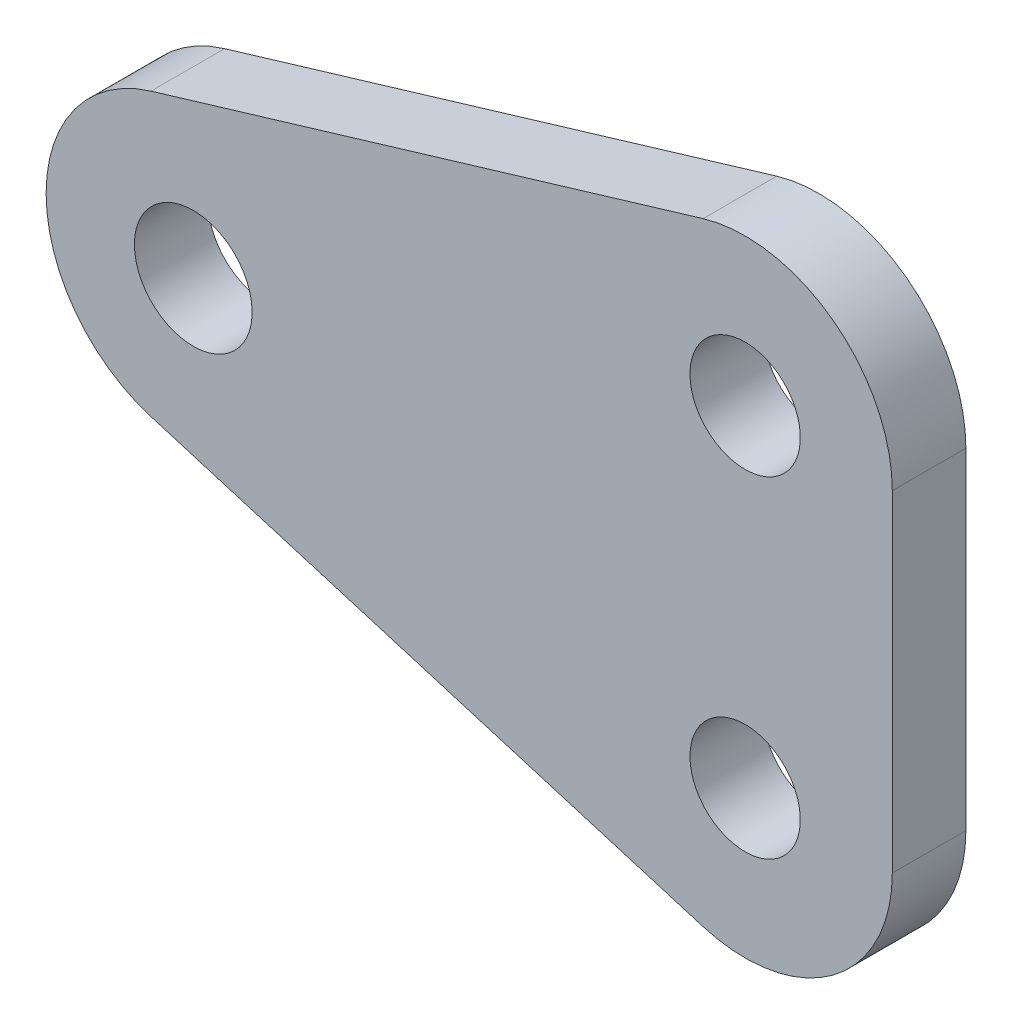
ISO-10303-21;
HEADER;
FILE_DESCRIPTION(('STEP AP214'),'2;1');
FILE_NAME('part.step','',(''),(''),'','','');
FILE_SCHEMA(('AUTOMOTIVE_DESIGN { 1 0 10303 214 1 1 1 1 }'));
ENDSEC;
DATA;
#1=APPLICATION_CONTEXT('core data for automotive mechanical design processes');
#2=APPLICATION_PROTOCOL_DEFINITION('international standard','automotive_design',2000,#1);
#3=PRODUCT_CONTEXT('',#1,'mechanical');
#4=PRODUCT('Part','Part','',(#3));
#5=PRODUCT_RELATED_PRODUCT_CATEGORY('part','',(#4));
#6=PRODUCT_DEFINITION_FORMATION('','',#4);
#7=PRODUCT_DEFINITION_CONTEXT('part definition',#1,'design');
#8=PRODUCT_DEFINITION('design','',#6,#7);
#9=PRODUCT_DEFINITION_SHAPE('','',#8);
#10=(LENGTH_UNIT() NAMED_UNIT(*) SI_UNIT(.MILLI.,.METRE.));
#11=(NAMED_UNIT(*) PLANE_ANGLE_UNIT() SI_UNIT($,.RADIAN.));
#12=(NAMED_UNIT(*) SI_UNIT($,.STERADIAN.) SOLID_ANGLE_UNIT());
#13=UNCERTAINTY_MEASURE_WITH_UNIT(LENGTH_MEASURE(1.E-05),#10,'distance_accuracy_value','');
#14=(GEOMETRIC_REPRESENTATION_CONTEXT(3) GLOBAL_UNCERTAINTY_ASSIGNED_CONTEXT((#13)) GLOBAL_UNIT_ASSIGNED_CONTEXT((#10,
#11,#12)) REPRESENTATION_CONTEXT('',''));
#15=CARTESIAN_POINT('',(0.,0.,0.));
#16=DIRECTION('',(0.,0.,1.));
#17=DIRECTION('',(1.,0.,0.));
#18=AXIS2_PLACEMENT_3D('',#15,#16,#17);
#19=CARTESIAN_POINT('',(0.,0.,0.));
#20=DIRECTION('',(0.,0.,1.));
#21=DIRECTION('',(1.,0.,0.));
#22=AXIS2_PLACEMENT_3D('',#19,#20,#21);
#23=PLANE('',#22);
#24=CARTESIAN_POINT('',(1720.59652241084,1047.22337309637,0.));
#25=DIRECTION('',(0.,0.,-1.));
#26=DIRECTION('',(-1.,0.,0.));
#27=AXIS2_PLACEMENT_3D('',#24,#25,#26);
#28=CIRCLE('',#27,4.);
#29=CARTESIAN_POINT('',(1719.44713139988,1051.05467839664,0.));
#30=VERTEX_POINT('',#29);
#31=CARTESIAN_POINT('',(1719.44713139988,1043.39206779609,0.));
#32=VERTEX_POINT('',#31);
#33=EDGE_CURVE('E119',#30,#32,#28,.F.);
#34=ORIENTED_EDGE('',*,*,#33,.F.);
#35=DIRECTION('',(-0.957826364917361,-0.287347619912181,0.));
#36=VECTOR('',#35,1.);
#37=CARTESIAN_POINT('',(-147.308424359633,491.02857601261,0.));
#38=LINE('',#37,#36);
#39=CARTESIAN_POINT('',(1734.45277928306,1055.5563682252,0.));
#40=VERTEX_POINT('',#39);
#41=EDGE_CURVE('E100',#40,#30,#38,.T.);
#42=ORIENTED_EDGE('',*,*,#41,.F.);
#43=CARTESIAN_POINT('',(1735.59652241084,1051.72337309637,0.));
#44=DIRECTION('',(0.,0.,-1.));
#45=DIRECTION('',(-1.,0.,0.));
#46=AXIS2_PLACEMENT_3D('',#43,#44,#45);
#47=CIRCLE('',#46,4.);
#48=CARTESIAN_POINT('',(1739.59652241084,1051.72337309637,0.));
#49=VERTEX_POINT('',#48);
#50=EDGE_CURVE('E73',#49,#40,#47,.F.);
#51=ORIENTED_EDGE('',*,*,#50,.F.);
#52=DIRECTION('',(0.,1.,0.));
#53=VECTOR('',#52,1.);
#54=CARTESIAN_POINT('',(1739.59652241084,0.,0.));
#55=LINE('',#54,#53);
#56=CARTESIAN_POINT('',(1739.59652241084,1042.72337309637,0.));
#57=VERTEX_POINT('',#56);
#58=EDGE_CURVE('E70',#57,#49,#55,.T.);
#59=ORIENTED_EDGE('',*,*,#58,.F.);
#60=CARTESIAN_POINT('',(1735.59652241084,1042.72337309637,0.));
#61=DIRECTION('',(0.,0.,-1.));
#62=DIRECTION('',(-1.,0.,0.));
#63=AXIS2_PLACEMENT_3D('',#60,#61,#62);
#64=CIRCLE('',#63,4.);
#65=CARTESIAN_POINT('',(1734.45277928306,1038.89037796753,0.));
#66=VERTEX_POINT('',#65);
#67=EDGE_CURVE('E67',#66,#57,#64,.F.);
#68=ORIENTED_EDGE('',*,*,#67,.F.);
#69=DIRECTION('',(-0.957826364917361,0.287347619912181,0.));
#70=VECTOR('',#69,1.);
#71=CARTESIAN_POINT('',(429.144323568253,1430.48252007072,0.));
#72=LINE('',#71,#70);
#73=EDGE_CURVE('E85',#66,#32,#72,.T.);
#74=ORIENTED_EDGE('',*,*,#73,.T.);
#75=EDGE_LOOP('',(#34,#42,#51,#59,#68,#74));
#76=FACE_BOUND('',#75,.T.);
#77=CARTESIAN_POINT('',(1735.59652241084,1042.72337309637,0.));
#78=DIRECTION('',(0.,0.,-1.));
#79=DIRECTION('',(-1.,0.,0.));
#80=AXIS2_PLACEMENT_3D('',#77,#78,#79);
#81=CIRCLE('',#80,1.50000000000006);
#82=CARTESIAN_POINT('',(1734.09652241084,1042.72337309637,0.));
#83=VERTEX_POINT('',#82);
#84=EDGE_CURVE('E99',#83,#83,#81,.F.);
#85=ORIENTED_EDGE('',*,*,#84,.T.);
#86=EDGE_LOOP('',(#85));
#87=FACE_BOUND('',#86,.T.);
#88=CARTESIAN_POINT('',(1735.59652241084,1051.72337309637,0.));
#89=DIRECTION('',(0.,0.,-1.));
#90=DIRECTION('',(-1.,0.,0.));
#91=AXIS2_PLACEMENT_3D('',#88,#89,#90);
#92=CIRCLE('',#91,1.50000000000006);
#93=CARTESIAN_POINT('',(1734.09652241084,1051.72337309637,0.));
#94=VERTEX_POINT('',#93);
#95=EDGE_CURVE('E123',#94,#94,#92,.F.);
#96=ORIENTED_EDGE('',*,*,#95,.T.);
#97=EDGE_LOOP('',(#96));
#98=FACE_BOUND('',#97,.T.);
#99=CARTESIAN_POINT('',(1720.59652241084,1047.22337309637,0.));
#100=DIRECTION('',(0.,0.,-1.));
#101=DIRECTION('',(-1.,0.,0.));
#102=AXIS2_PLACEMENT_3D('',#99,#100,#101);
#103=CIRCLE('',#102,1.60000000039995);
#104=CARTESIAN_POINT('',(1718.99652241044,1047.22337309637,0.));
#105=VERTEX_POINT('',#104);
#106=EDGE_CURVE('E20',#105,#105,#103,.F.);
#107=ORIENTED_EDGE('',*,*,#106,.T.);
#108=EDGE_LOOP('',(#107));
#109=FACE_BOUND('',#108,.T.);
#110=ADVANCED_FACE('F17',(#76,#87,#98,#109),#23,.F.);
#111=CARTESIAN_POINT('',(1720.59652241084,1047.22337309637,2.));
#112=DIRECTION('',(0.,0.,-1.));
#113=DIRECTION('',(-1.,0.,0.));
#114=AXIS2_PLACEMENT_3D('',#111,#112,#113);
#115=CYLINDRICAL_SURFACE('',#114,1.60000000039995);
#116=CARTESIAN_POINT('',(1720.59652241084,1047.22337309637,2.));
#117=DIRECTION('',(0.,0.,-1.));
#118=DIRECTION('',(-1.,0.,0.));
#119=AXIS2_PLACEMENT_3D('',#116,#117,#118);
#120=CIRCLE('',#119,1.60000000039995);
#121=CARTESIAN_POINT('',(1718.99652241044,1047.22337309637,2.));
#122=VERTEX_POINT('',#121);
#123=EDGE_CURVE('E115',#122,#122,#120,.T.);
#124=ORIENTED_EDGE('',*,*,#123,.F.);
#125=EDGE_LOOP('',(#124));
#126=FACE_BOUND('',#125,.T.);
#127=ORIENTED_EDGE('',*,*,#106,.F.);
#128=EDGE_LOOP('',(#127));
#129=FACE_BOUND('',#128,.T.);
#130=ADVANCED_FACE('F131',(#126,#129),#115,.F.);
#131=CARTESIAN_POINT('',(1735.59652241084,1051.72337309637,2.));
#132=DIRECTION('',(0.,0.,-1.));
#133=DIRECTION('',(-1.,0.,0.));
#134=AXIS2_PLACEMENT_3D('',#131,#132,#133);
#135=CYLINDRICAL_SURFACE('',#134,1.50000000000006);
#136=CARTESIAN_POINT('',(1735.59652241084,1051.72337309637,2.));
#137=DIRECTION('',(0.,0.,-1.));
#138=DIRECTION('',(-1.,0.,0.));
#139=AXIS2_PLACEMENT_3D('',#136,#137,#138);
#140=CIRCLE('',#139,1.50000000000006);
#141=CARTESIAN_POINT('',(1734.09652241084,1051.72337309637,2.));
#142=VERTEX_POINT('',#141);
#143=EDGE_CURVE('E112',#142,#142,#140,.T.);
#144=ORIENTED_EDGE('',*,*,#143,.F.);
#145=EDGE_LOOP('',(#144));
#146=FACE_BOUND('',#145,.T.);
#147=ORIENTED_EDGE('',*,*,#95,.F.);
#148=EDGE_LOOP('',(#147));
#149=FACE_BOUND('',#148,.T.);
#150=ADVANCED_FACE('F133',(#146,#149),#135,.F.);
#151=CARTESIAN_POINT('',(1735.59652241084,1042.72337309637,2.));
#152=DIRECTION('',(0.,0.,-1.));
#153=DIRECTION('',(-1.,0.,0.));
#154=AXIS2_PLACEMENT_3D('',#151,#152,#153);
#155=CYLINDRICAL_SURFACE('',#154,1.50000000000006);
#156=CARTESIAN_POINT('',(1735.59652241084,1042.72337309637,2.));
#157=DIRECTION('',(0.,0.,-1.));
#158=DIRECTION('',(-1.,0.,0.));
#159=AXIS2_PLACEMENT_3D('',#156,#157,#158);
#160=CIRCLE('',#159,1.50000000000006);
#161=CARTESIAN_POINT('',(1734.09652241084,1042.72337309637,2.));
#162=VERTEX_POINT('',#161);
#163=EDGE_CURVE('E109',#162,#162,#160,.T.);
#164=ORIENTED_EDGE('',*,*,#163,.F.);
#165=EDGE_LOOP('',(#164));
#166=FACE_BOUND('',#165,.T.);
#167=ORIENTED_EDGE('',*,*,#84,.F.);
#168=EDGE_LOOP('',(#167));
#169=FACE_BOUND('',#168,.T.);
#170=ADVANCED_FACE('F140',(#166,#169),#155,.F.);
#171=CARTESIAN_POINT('',(429.144323568253,1430.48252007072,2.));
#172=DIRECTION('',(0.287347619912181,0.957826364917361,0.));
#173=DIRECTION('',(-0.957826364917361,0.287347619912181,0.));
#174=AXIS2_PLACEMENT_3D('',#171,#172,#173);
#175=PLANE('',#174);
#176=DIRECTION('',(0.,0.,-1.));
#177=VECTOR('',#176,1.);
#178=CARTESIAN_POINT('',(1734.45277928306,1038.89037796753,2.));
#179=LINE('',#178,#177);
#180=CARTESIAN_POINT('',(1734.45277928306,1038.89037796753,2.));
#181=VERTEX_POINT('',#180);
#182=EDGE_CURVE('E78',#181,#66,#179,.T.);
#183=ORIENTED_EDGE('',*,*,#182,.F.);
#184=DIRECTION('',(0.957826364917361,-0.287347619912181,0.));
#185=VECTOR('',#184,1.);
#186=CARTESIAN_POINT('',(1719.44713086857,1043.39206795548,2.));
#187=LINE('',#186,#185);
#188=CARTESIAN_POINT('',(1719.44713139988,1043.39206779609,2.));
#189=VERTEX_POINT('',#188);
#190=EDGE_CURVE('E108',#189,#181,#187,.T.);
#191=ORIENTED_EDGE('',*,*,#190,.F.);
#192=DIRECTION('',(0.,0.,-1.));
#193=VECTOR('',#192,1.);
#194=CARTESIAN_POINT('',(1719.44713086857,1043.39206795548,2.));
#195=LINE('',#194,#193);
#196=EDGE_CURVE('E118',#32,#189,#195,.F.);
#197=ORIENTED_EDGE('',*,*,#196,.F.);
#198=ORIENTED_EDGE('',*,*,#73,.F.);
#199=EDGE_LOOP('',(#183,#191,#197,#198));
#200=FACE_BOUND('',#199,.T.);
#201=ADVANCED_FACE('F167',(#200),#175,.F.);
#202=CARTESIAN_POINT('',(1735.59652241084,1042.72337309637,2.));
#203=DIRECTION('',(0.,0.,-1.));
#204=DIRECTION('',(-1.,0.,0.));
#205=AXIS2_PLACEMENT_3D('',#202,#203,#204);
#206=CYLINDRICAL_SURFACE('',#205,4.);
#207=CARTESIAN_POINT('',(1735.59652241084,1042.72337309637,2.));
#208=DIRECTION('',(0.,0.,-1.));
#209=DIRECTION('',(-1.,0.,0.));
#210=AXIS2_PLACEMENT_3D('',#207,#208,#209);
#211=CIRCLE('',#210,4.);
#212=CARTESIAN_POINT('',(1739.59652241084,1042.72337309637,2.));
#213=VERTEX_POINT('',#212);
#214=EDGE_CURVE('E106',#181,#213,#211,.F.);
#215=ORIENTED_EDGE('',*,*,#214,.F.);
#216=ORIENTED_EDGE('',*,*,#182,.T.);
#217=ORIENTED_EDGE('',*,*,#67,.T.);
#218=DIRECTION('',(0.,0.,-1.));
#219=VECTOR('',#218,1.);
#220=CARTESIAN_POINT('',(1739.59652241084,1042.72337309637,2.));
#221=LINE('',#220,#219);
#222=EDGE_CURVE('E77',#213,#57,#221,.T.);
#223=ORIENTED_EDGE('',*,*,#222,.F.);
#224=EDGE_LOOP('',(#215,#216,#217,#223));
#225=FACE_BOUND('',#224,.T.);
#226=ADVANCED_FACE('F83',(#225),#206,.T.);
#227=CARTESIAN_POINT('',(1739.59652241084,0.,2.));
#228=DIRECTION('',(1.,0.,0.));
#229=DIRECTION('',(0.,0.,-1.));
#230=AXIS2_PLACEMENT_3D('',#227,#228,#229);
#231=PLANE('',#230);
#232=DIRECTION('',(0.,1.,0.));
#233=VECTOR('',#232,1.);
#234=CARTESIAN_POINT('',(1739.59652241084,0.,2.));
#235=LINE('',#234,#233);
#236=CARTESIAN_POINT('',(1739.59652241084,1051.72337309637,2.));
#237=VERTEX_POINT('',#236);
#238=EDGE_CURVE('E89',#213,#237,#235,.T.);
#239=ORIENTED_EDGE('',*,*,#238,.F.);
#240=ORIENTED_EDGE('',*,*,#222,.T.);
#241=ORIENTED_EDGE('',*,*,#58,.T.);
#242=DIRECTION('',(0.,0.,-1.));
#243=VECTOR('',#242,1.);
#244=CARTESIAN_POINT('',(1739.59652241084,1051.72337309637,2.));
#245=LINE('',#244,#243);
#246=EDGE_CURVE('E92',#237,#49,#245,.T.);
#247=ORIENTED_EDGE('',*,*,#246,.F.);
#248=EDGE_LOOP('',(#239,#240,#241,#247));
#249=FACE_BOUND('',#248,.T.);
#250=ADVANCED_FACE('F87',(#249),#231,.T.);
#251=CARTESIAN_POINT('',(1735.59652241084,1051.72337309637,2.));
#252=DIRECTION('',(0.,0.,-1.));
#253=DIRECTION('',(-1.,0.,0.));
#254=AXIS2_PLACEMENT_3D('',#251,#252,#253);
#255=CYLINDRICAL_SURFACE('',#254,4.);
#256=CARTESIAN_POINT('',(1735.59652241084,1051.72337309637,2.));
#257=DIRECTION('',(0.,0.,-1.));
#258=DIRECTION('',(-1.,0.,0.));
#259=AXIS2_PLACEMENT_3D('',#256,#257,#258);
#260=CIRCLE('',#259,4.);
#261=CARTESIAN_POINT('',(1734.45277928306,1055.5563682252,2.));
#262=VERTEX_POINT('',#261);
#263=EDGE_CURVE('E103',#237,#262,#260,.F.);
#264=ORIENTED_EDGE('',*,*,#263,.F.);
#265=ORIENTED_EDGE('',*,*,#246,.T.);
#266=ORIENTED_EDGE('',*,*,#50,.T.);
#267=DIRECTION('',(0.,0.,1.));
#268=VECTOR('',#267,1.);
#269=CARTESIAN_POINT('',(1734.45277928306,1055.5563682252,2.));
#270=LINE('',#269,#268);
#271=EDGE_CURVE('E101',#262,#40,#270,.F.);
#272=ORIENTED_EDGE('',*,*,#271,.F.);
#273=EDGE_LOOP('',(#264,#265,#266,#272));
#274=FACE_BOUND('',#273,.T.);
#275=ADVANCED_FACE('F159',(#274),#255,.T.);
#276=CARTESIAN_POINT('',(-147.308424359633,491.02857601261,2.));
#277=DIRECTION('',(-0.287347619912181,0.957826364917361,0.));
#278=DIRECTION('',(-0.957826364917361,-0.287347619912181,0.));
#279=AXIS2_PLACEMENT_3D('',#276,#277,#278);
#280=PLANE('',#279);
#281=DIRECTION('',(-0.957826364917359,-0.287347619912185,0.));
#282=VECTOR('',#281,1.);
#283=CARTESIAN_POINT('',(1734.45277928306,1055.5563682252,2.));
#284=LINE('',#283,#282);
#285=CARTESIAN_POINT('',(1719.44713139988,1051.05467839664,2.));
#286=VERTEX_POINT('',#285);
#287=EDGE_CURVE('E26',#262,#286,#284,.T.);
#288=ORIENTED_EDGE('',*,*,#287,.F.);
#289=ORIENTED_EDGE('',*,*,#271,.T.);
#290=ORIENTED_EDGE('',*,*,#41,.T.);
#291=DIRECTION('',(0.,0.,-1.));
#292=VECTOR('',#291,1.);
#293=CARTESIAN_POINT('',(1719.44713086857,1051.05467823725,2.));
#294=LINE('',#293,#292);
#295=EDGE_CURVE('E35',#286,#30,#294,.T.);
#296=ORIENTED_EDGE('',*,*,#295,.F.);
#297=EDGE_LOOP('',(#288,#289,#290,#296));
#298=FACE_BOUND('',#297,.T.);
#299=ADVANCED_FACE('F152',(#298),#280,.T.);
#300=CARTESIAN_POINT('',(1720.59652241084,1047.22337309637,2.));
#301=DIRECTION('',(0.,0.,-1.));
#302=DIRECTION('',(-1.,0.,0.));
#303=AXIS2_PLACEMENT_3D('',#300,#301,#302);
#304=CYLINDRICAL_SURFACE('',#303,4.);
#305=ORIENTED_EDGE('',*,*,#33,.T.);
#306=ORIENTED_EDGE('',*,*,#196,.T.);
#307=CARTESIAN_POINT('',(1720.59652241084,1047.22337309637,2.));
#308=DIRECTION('',(0.,0.,-1.));
#309=DIRECTION('',(-1.,0.,0.));
#310=AXIS2_PLACEMENT_3D('',#307,#308,#309);
#311=CIRCLE('',#310,4.);
#312=EDGE_CURVE('E11',#286,#189,#311,.F.);
#313=ORIENTED_EDGE('',*,*,#312,.F.);
#314=ORIENTED_EDGE('',*,*,#295,.T.);
#315=EDGE_LOOP('',(#305,#306,#313,#314));
#316=FACE_BOUND('',#315,.T.);
#317=ADVANCED_FACE('F146',(#316),#304,.T.);
#318=CARTESIAN_POINT('',(0.,0.,2.));
#319=DIRECTION('',(0.,0.,1.));
#320=DIRECTION('',(1.,0.,0.));
#321=AXIS2_PLACEMENT_3D('',#318,#319,#320);
#322=PLANE('',#321);
#323=ORIENTED_EDGE('',*,*,#312,.T.);
#324=ORIENTED_EDGE('',*,*,#190,.T.);
#325=ORIENTED_EDGE('',*,*,#214,.T.);
#326=ORIENTED_EDGE('',*,*,#238,.T.);
#327=ORIENTED_EDGE('',*,*,#263,.T.);
#328=ORIENTED_EDGE('',*,*,#287,.T.);
#329=EDGE_LOOP('',(#323,#324,#325,#326,#327,#328));
#330=FACE_BOUND('',#329,.T.);
#331=ORIENTED_EDGE('',*,*,#163,.T.);
#332=EDGE_LOOP('',(#331));
#333=FACE_BOUND('',#332,.T.);
#334=ORIENTED_EDGE('',*,*,#143,.T.);
#335=EDGE_LOOP('',(#334));
#336=FACE_BOUND('',#335,.T.);
#337=ORIENTED_EDGE('',*,*,#123,.T.);
#338=EDGE_LOOP('',(#337));
#339=FACE_BOUND('',#338,.T.);
#340=ADVANCED_FACE('F144',(#330,#333,#336,#339),#322,.T.);
#341=CLOSED_SHELL('',(#110,#130,#150,#170,#201,#226,#250,#275,#299,#317,#340));
#342=MANIFOLD_SOLID_BREP('B1',#341);
#343=ADVANCED_BREP_SHAPE_REPRESENTATION('',(#18,#342),#14);
#344=SHAPE_DEFINITION_REPRESENTATION(#9,#343);
ENDSEC;
END-ISO-10303-21;
